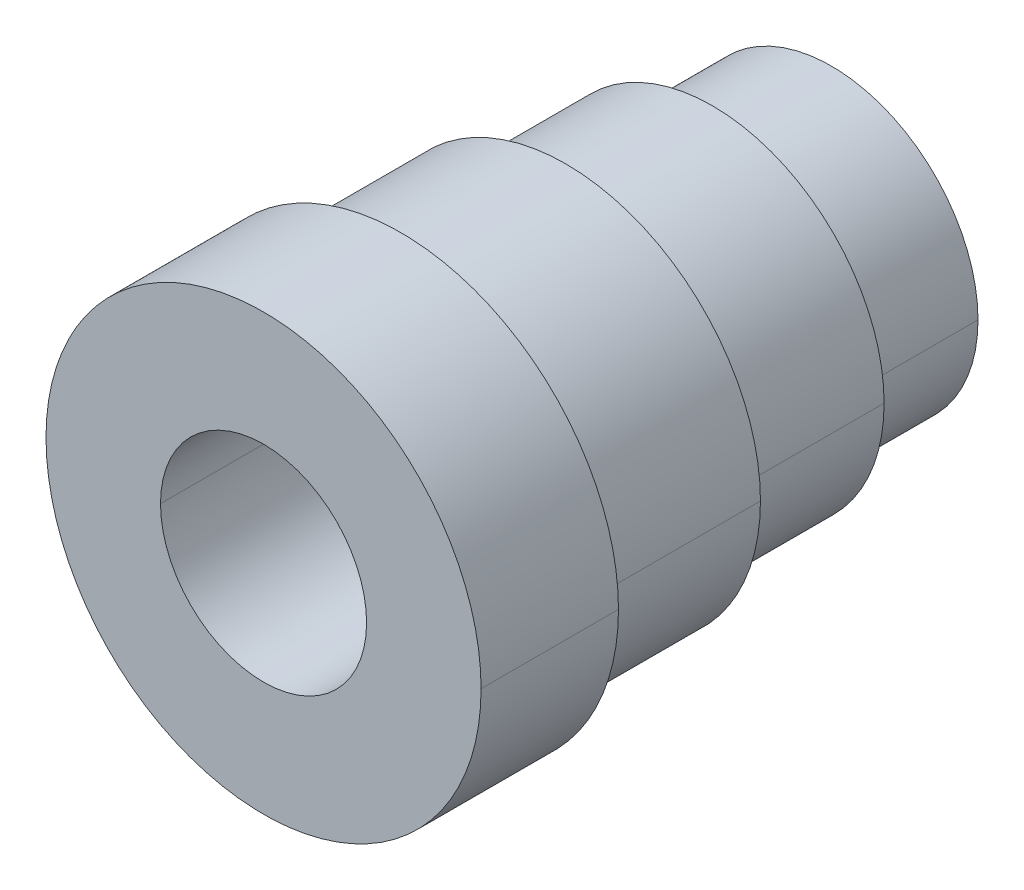
ISO-10303-21;
HEADER;
FILE_DESCRIPTION(('STEP AP214'),'2;1');
FILE_NAME('part.step','',(''),(''),'','','');
FILE_SCHEMA(('AUTOMOTIVE_DESIGN { 1 0 10303 214 1 1 1 1 }'));
ENDSEC;
DATA;
#1=APPLICATION_CONTEXT('core data for automotive mechanical design processes');
#2=APPLICATION_PROTOCOL_DEFINITION('international standard','automotive_design',2000,#1);
#3=PRODUCT_CONTEXT('',#1,'mechanical');
#4=PRODUCT('Part','Part','',(#3));
#5=PRODUCT_RELATED_PRODUCT_CATEGORY('part','',(#4));
#6=PRODUCT_DEFINITION_FORMATION('','',#4);
#7=PRODUCT_DEFINITION_CONTEXT('part definition',#1,'design');
#8=PRODUCT_DEFINITION('design','',#6,#7);
#9=PRODUCT_DEFINITION_SHAPE('','',#8);
#10=(LENGTH_UNIT() NAMED_UNIT(*) SI_UNIT(.MILLI.,.METRE.));
#11=(NAMED_UNIT(*) PLANE_ANGLE_UNIT() SI_UNIT($,.RADIAN.));
#12=(NAMED_UNIT(*) SI_UNIT($,.STERADIAN.) SOLID_ANGLE_UNIT());
#13=UNCERTAINTY_MEASURE_WITH_UNIT(LENGTH_MEASURE(1.E-05),#10,'distance_accuracy_value','');
#14=(GEOMETRIC_REPRESENTATION_CONTEXT(3) GLOBAL_UNCERTAINTY_ASSIGNED_CONTEXT((#13)) GLOBAL_UNIT_ASSIGNED_CONTEXT((#10,
#11,#12)) REPRESENTATION_CONTEXT('',''));
#15=CARTESIAN_POINT('',(0.,0.,0.));
#16=DIRECTION('',(0.,0.,1.));
#17=DIRECTION('',(1.,0.,0.));
#18=AXIS2_PLACEMENT_3D('',#15,#16,#17);
#19=CARTESIAN_POINT('',(12.7,0.,2.6));
#20=DIRECTION('',(0.,0.,1.));
#21=DIRECTION('',(1.,0.,0.));
#22=AXIS2_PLACEMENT_3D('',#19,#20,#21);
#23=CYLINDRICAL_SURFACE('',#22,2.5);
#24=CARTESIAN_POINT('',(12.7,0.,-9.8));
#25=DIRECTION('',(0.,0.,1.));
#26=DIRECTION('',(1.,0.,0.));
#27=AXIS2_PLACEMENT_3D('',#24,#25,#26);
#28=CIRCLE('',#27,2.5);
#29=CARTESIAN_POINT('',(10.2,0.,-9.8));
#30=VERTEX_POINT('',#29);
#31=CARTESIAN_POINT('',(15.2,0.,-9.8));
#32=VERTEX_POINT('',#31);
#33=EDGE_CURVE('E42',#30,#32,#28,.T.);
#34=ORIENTED_EDGE('',*,*,#33,.F.);
#35=DIRECTION('',(0.,0.,1.));
#36=VECTOR('',#35,1.);
#37=CARTESIAN_POINT('',(10.2,0.,2.6));
#38=LINE('',#37,#36);
#39=CARTESIAN_POINT('',(10.2,0.,-7.3));
#40=VERTEX_POINT('',#39);
#41=EDGE_CURVE('E11',#30,#40,#38,.T.);
#42=ORIENTED_EDGE('',*,*,#41,.T.);
#43=CARTESIAN_POINT('',(12.7,0.,-7.3));
#44=DIRECTION('',(0.,0.,1.));
#45=DIRECTION('',(1.,0.,0.));
#46=AXIS2_PLACEMENT_3D('',#43,#44,#45);
#47=CIRCLE('',#46,2.5);
#48=CARTESIAN_POINT('',(15.2,0.,-7.3));
#49=VERTEX_POINT('',#48);
#50=EDGE_CURVE('E28',#40,#49,#47,.T.);
#51=ORIENTED_EDGE('',*,*,#50,.T.);
#52=DIRECTION('',(0.,0.,1.));
#53=VECTOR('',#52,1.);
#54=CARTESIAN_POINT('',(15.2,0.,2.6));
#55=LINE('',#54,#53);
#56=EDGE_CURVE('E212',#32,#49,#55,.T.);
#57=ORIENTED_EDGE('',*,*,#56,.F.);
#58=EDGE_LOOP('',(#34,#42,#51,#57));
#59=FACE_BOUND('',#58,.T.);
#60=ADVANCED_FACE('F17',(#59),#23,.F.);
#61=CARTESIAN_POINT('',(12.7,0.,2.6));
#62=DIRECTION('',(0.,0.,1.));
#63=DIRECTION('',(1.,0.,0.));
#64=AXIS2_PLACEMENT_3D('',#61,#62,#63);
#65=CYLINDRICAL_SURFACE('',#64,3.2);
#66=CARTESIAN_POINT('',(12.7,0.,-9.8));
#67=DIRECTION('',(0.,0.,1.));
#68=DIRECTION('',(1.,0.,0.));
#69=AXIS2_PLACEMENT_3D('',#66,#67,#68);
#70=CIRCLE('',#69,3.2);
#71=CARTESIAN_POINT('',(15.9,0.,-9.8));
#72=VERTEX_POINT('',#71);
#73=CARTESIAN_POINT('',(9.5,0.,-9.8));
#74=VERTEX_POINT('',#73);
#75=EDGE_CURVE('E204',#72,#74,#70,.T.);
#76=ORIENTED_EDGE('',*,*,#75,.T.);
#77=DIRECTION('',(0.,0.,1.));
#78=VECTOR('',#77,1.);
#79=CARTESIAN_POINT('',(9.5,0.,2.6));
#80=LINE('',#79,#78);
#81=CARTESIAN_POINT('',(9.5,0.,-7.2));
#82=VERTEX_POINT('',#81);
#83=EDGE_CURVE('E192',#74,#82,#80,.T.);
#84=ORIENTED_EDGE('',*,*,#83,.T.);
#85=CARTESIAN_POINT('',(12.7,0.,-7.2));
#86=DIRECTION('',(0.,0.,1.));
#87=DIRECTION('',(1.,0.,0.));
#88=AXIS2_PLACEMENT_3D('',#85,#86,#87);
#89=CIRCLE('',#88,3.2);
#90=CARTESIAN_POINT('',(15.9,0.,-7.2));
#91=VERTEX_POINT('',#90);
#92=EDGE_CURVE('E229',#91,#82,#89,.T.);
#93=ORIENTED_EDGE('',*,*,#92,.F.);
#94=DIRECTION('',(0.,0.,1.));
#95=VECTOR('',#94,1.);
#96=CARTESIAN_POINT('',(15.9,0.,2.6));
#97=LINE('',#96,#95);
#98=EDGE_CURVE('E183',#72,#91,#97,.T.);
#99=ORIENTED_EDGE('',*,*,#98,.F.);
#100=EDGE_LOOP('',(#76,#84,#93,#99));
#101=FACE_BOUND('',#100,.T.);
#102=ADVANCED_FACE('F288',(#101),#65,.T.);
#103=CARTESIAN_POINT('',(12.7,0.,2.6));
#104=DIRECTION('',(0.,0.,1.));
#105=DIRECTION('',(1.,0.,0.));
#106=AXIS2_PLACEMENT_3D('',#103,#104,#105);
#107=CYLINDRICAL_SURFACE('',#106,3.75);
#108=CARTESIAN_POINT('',(12.7,0.,-7.2));
#109=DIRECTION('',(0.,0.,1.));
#110=DIRECTION('',(1.,0.,0.));
#111=AXIS2_PLACEMENT_3D('',#108,#109,#110);
#112=CIRCLE('',#111,3.75);
#113=CARTESIAN_POINT('',(16.45,0.,-7.2));
#114=VERTEX_POINT('',#113);
#115=CARTESIAN_POINT('',(8.95,0.,-7.2));
#116=VERTEX_POINT('',#115);
#117=EDGE_CURVE('E188',#114,#116,#112,.T.);
#118=ORIENTED_EDGE('',*,*,#117,.T.);
#119=DIRECTION('',(0.,0.,1.));
#120=VECTOR('',#119,1.);
#121=CARTESIAN_POINT('',(8.95,0.,2.6));
#122=LINE('',#121,#120);
#123=CARTESIAN_POINT('',(8.95,0.,-4.));
#124=VERTEX_POINT('',#123);
#125=EDGE_CURVE('E193',#116,#124,#122,.T.);
#126=ORIENTED_EDGE('',*,*,#125,.T.);
#127=CARTESIAN_POINT('',(12.7,0.,-4.));
#128=DIRECTION('',(0.,0.,1.));
#129=DIRECTION('',(1.,0.,0.));
#130=AXIS2_PLACEMENT_3D('',#127,#128,#129);
#131=CIRCLE('',#130,3.75);
#132=CARTESIAN_POINT('',(16.45,0.,-4.));
#133=VERTEX_POINT('',#132);
#134=EDGE_CURVE('E158',#133,#124,#131,.T.);
#135=ORIENTED_EDGE('',*,*,#134,.F.);
#136=DIRECTION('',(0.,0.,1.));
#137=VECTOR('',#136,1.);
#138=CARTESIAN_POINT('',(16.45,0.,2.6));
#139=LINE('',#138,#137);
#140=EDGE_CURVE('E225',#114,#133,#139,.T.);
#141=ORIENTED_EDGE('',*,*,#140,.F.);
#142=EDGE_LOOP('',(#118,#126,#135,#141));
#143=FACE_BOUND('',#142,.T.);
#144=ADVANCED_FACE('F278',(#143),#107,.T.);
#145=CARTESIAN_POINT('',(12.7,0.,2.6));
#146=DIRECTION('',(0.,0.,1.));
#147=DIRECTION('',(1.,0.,0.));
#148=AXIS2_PLACEMENT_3D('',#145,#146,#147);
#149=CYLINDRICAL_SURFACE('',#148,4.25);
#150=CARTESIAN_POINT('',(12.7,0.,-4.));
#151=DIRECTION('',(0.,0.,1.));
#152=DIRECTION('',(1.,0.,0.));
#153=AXIS2_PLACEMENT_3D('',#150,#151,#152);
#154=CIRCLE('',#153,4.25);
#155=CARTESIAN_POINT('',(16.95,0.,-4.));
#156=VERTEX_POINT('',#155);
#157=CARTESIAN_POINT('',(8.45,0.,-4.));
#158=VERTEX_POINT('',#157);
#159=EDGE_CURVE('E194',#156,#158,#154,.T.);
#160=ORIENTED_EDGE('',*,*,#159,.T.);
#161=DIRECTION('',(0.,0.,1.));
#162=VECTOR('',#161,1.);
#163=CARTESIAN_POINT('',(8.45,0.,2.6));
#164=LINE('',#163,#162);
#165=CARTESIAN_POINT('',(8.45,0.,-0.4));
#166=VERTEX_POINT('',#165);
#167=EDGE_CURVE('E163',#158,#166,#164,.T.);
#168=ORIENTED_EDGE('',*,*,#167,.T.);
#169=CARTESIAN_POINT('',(12.7,0.,-0.4));
#170=DIRECTION('',(0.,0.,1.));
#171=DIRECTION('',(1.,0.,0.));
#172=AXIS2_PLACEMENT_3D('',#169,#170,#171);
#173=CIRCLE('',#172,4.25);
#174=CARTESIAN_POINT('',(16.95,0.,-0.4));
#175=VERTEX_POINT('',#174);
#176=EDGE_CURVE('E161',#175,#166,#173,.T.);
#177=ORIENTED_EDGE('',*,*,#176,.F.);
#178=DIRECTION('',(0.,0.,1.));
#179=VECTOR('',#178,1.);
#180=CARTESIAN_POINT('',(16.95,0.,2.6));
#181=LINE('',#180,#179);
#182=EDGE_CURVE('E147',#156,#175,#181,.T.);
#183=ORIENTED_EDGE('',*,*,#182,.F.);
#184=EDGE_LOOP('',(#160,#168,#177,#183));
#185=FACE_BOUND('',#184,.T.);
#186=ADVANCED_FACE('F162',(#185),#149,.T.);
#187=CARTESIAN_POINT('',(12.7,0.,2.6));
#188=DIRECTION('',(0.,0.,1.));
#189=DIRECTION('',(1.,0.,0.));
#190=AXIS2_PLACEMENT_3D('',#187,#188,#189);
#191=CYLINDRICAL_SURFACE('',#190,4.75);
#192=CARTESIAN_POINT('',(12.7,0.,-0.4));
#193=DIRECTION('',(0.,0.,1.));
#194=DIRECTION('',(1.,0.,0.));
#195=AXIS2_PLACEMENT_3D('',#192,#193,#194);
#196=CIRCLE('',#195,4.75);
#197=CARTESIAN_POINT('',(17.45,0.,-0.4));
#198=VERTEX_POINT('',#197);
#199=CARTESIAN_POINT('',(7.95,0.,-0.4));
#200=VERTEX_POINT('',#199);
#201=EDGE_CURVE('E250',#198,#200,#196,.T.);
#202=ORIENTED_EDGE('',*,*,#201,.T.);
#203=DIRECTION('',(0.,0.,1.));
#204=VECTOR('',#203,1.);
#205=CARTESIAN_POINT('',(7.95,0.,2.6));
#206=LINE('',#205,#204);
#207=CARTESIAN_POINT('',(7.95,0.,2.6));
#208=VERTEX_POINT('',#207);
#209=EDGE_CURVE('E254',#200,#208,#206,.T.);
#210=ORIENTED_EDGE('',*,*,#209,.T.);
#211=CARTESIAN_POINT('',(12.7,0.,2.6));
#212=DIRECTION('',(0.,0.,1.));
#213=DIRECTION('',(1.,0.,0.));
#214=AXIS2_PLACEMENT_3D('',#211,#212,#213);
#215=CIRCLE('',#214,4.75);
#216=CARTESIAN_POINT('',(17.45,0.,2.6));
#217=VERTEX_POINT('',#216);
#218=EDGE_CURVE('E115',#217,#208,#215,.T.);
#219=ORIENTED_EDGE('',*,*,#218,.F.);
#220=DIRECTION('',(0.,0.,1.));
#221=VECTOR('',#220,1.);
#222=CARTESIAN_POINT('',(17.45,0.,2.6));
#223=LINE('',#222,#221);
#224=EDGE_CURVE('E106',#198,#217,#223,.T.);
#225=ORIENTED_EDGE('',*,*,#224,.F.);
#226=EDGE_LOOP('',(#202,#210,#219,#225));
#227=FACE_BOUND('',#226,.T.);
#228=ADVANCED_FACE('F328',(#227),#191,.T.);
#229=CARTESIAN_POINT('',(12.7,0.,2.6));
#230=DIRECTION('',(0.,0.,1.));
#231=DIRECTION('',(1.,0.,0.));
#232=AXIS2_PLACEMENT_3D('',#229,#230,#231);
#233=CYLINDRICAL_SURFACE('',#232,2.25);
#234=CARTESIAN_POINT('',(12.7,0.,-7.3));
#235=DIRECTION('',(0.,0.,1.));
#236=DIRECTION('',(1.,0.,0.));
#237=AXIS2_PLACEMENT_3D('',#234,#235,#236);
#238=CIRCLE('',#237,2.25);
#239=CARTESIAN_POINT('',(10.45,0.,-7.3));
#240=VERTEX_POINT('',#239);
#241=CARTESIAN_POINT('',(14.95,0.,-7.3));
#242=VERTEX_POINT('',#241);
#243=EDGE_CURVE('E220',#240,#242,#238,.T.);
#244=ORIENTED_EDGE('',*,*,#243,.F.);
#245=DIRECTION('',(0.,0.,1.));
#246=VECTOR('',#245,1.);
#247=CARTESIAN_POINT('',(10.45,0.,2.6));
#248=LINE('',#247,#246);
#249=CARTESIAN_POINT('',(10.45,0.,2.6));
#250=VERTEX_POINT('',#249);
#251=EDGE_CURVE('E199',#240,#250,#248,.T.);
#252=ORIENTED_EDGE('',*,*,#251,.T.);
#253=CARTESIAN_POINT('',(12.7,0.,2.6));
#254=DIRECTION('',(0.,0.,-1.));
#255=DIRECTION('',(1.,0.,0.));
#256=AXIS2_PLACEMENT_3D('',#253,#254,#255);
#257=CIRCLE('',#256,2.25);
#258=CARTESIAN_POINT('',(14.95,0.,2.6));
#259=VERTEX_POINT('',#258);
#260=EDGE_CURVE('E205',#259,#250,#257,.T.);
#261=ORIENTED_EDGE('',*,*,#260,.F.);
#262=DIRECTION('',(0.,0.,1.));
#263=VECTOR('',#262,1.);
#264=CARTESIAN_POINT('',(14.95,0.,2.6));
#265=LINE('',#264,#263);
#266=EDGE_CURVE('E21',#242,#259,#265,.T.);
#267=ORIENTED_EDGE('',*,*,#266,.F.);
#268=EDGE_LOOP('',(#244,#252,#261,#267));
#269=FACE_BOUND('',#268,.T.);
#270=ADVANCED_FACE('F334',(#269),#233,.F.);
#271=CARTESIAN_POINT('',(9.55,0.,2.6));
#272=DIRECTION('',(0.,0.,1.));
#273=DIRECTION('',(1.,0.,0.));
#274=AXIS2_PLACEMENT_3D('',#271,#272,#273);
#275=PLANE('',#274);
#276=ORIENTED_EDGE('',*,*,#218,.T.);
#277=CARTESIAN_POINT('',(12.7,0.,2.6));
#278=DIRECTION('',(0.,0.,1.));
#279=DIRECTION('',(1.,0.,0.));
#280=AXIS2_PLACEMENT_3D('',#277,#278,#279);
#281=CIRCLE('',#280,4.75);
#282=EDGE_CURVE('E200',#208,#217,#281,.T.);
#283=ORIENTED_EDGE('',*,*,#282,.T.);
#284=EDGE_LOOP('',(#276,#283));
#285=FACE_BOUND('',#284,.T.);
#286=ORIENTED_EDGE('',*,*,#260,.T.);
#287=CARTESIAN_POINT('',(12.7,0.,2.6));
#288=DIRECTION('',(0.,0.,-1.));
#289=DIRECTION('',(1.,0.,0.));
#290=AXIS2_PLACEMENT_3D('',#287,#288,#289);
#291=CIRCLE('',#290,2.25);
#292=EDGE_CURVE('E208',#250,#259,#291,.T.);
#293=ORIENTED_EDGE('',*,*,#292,.T.);
#294=EDGE_LOOP('',(#286,#293));
#295=FACE_BOUND('',#294,.T.);
#296=ADVANCED_FACE('F19',(#285,#295),#275,.T.);
#297=CARTESIAN_POINT('',(12.7,0.,2.6));
#298=DIRECTION('',(0.,0.,1.));
#299=DIRECTION('',(1.,0.,0.));
#300=AXIS2_PLACEMENT_3D('',#297,#298,#299);
#301=CYLINDRICAL_SURFACE('',#300,2.25);
#302=ORIENTED_EDGE('',*,*,#251,.F.);
#303=CARTESIAN_POINT('',(12.7,0.,-7.3));
#304=DIRECTION('',(0.,0.,1.));
#305=DIRECTION('',(1.,0.,0.));
#306=AXIS2_PLACEMENT_3D('',#303,#304,#305);
#307=CIRCLE('',#306,2.25);
#308=EDGE_CURVE('E216',#242,#240,#307,.T.);
#309=ORIENTED_EDGE('',*,*,#308,.F.);
#310=ORIENTED_EDGE('',*,*,#266,.T.);
#311=ORIENTED_EDGE('',*,*,#292,.F.);
#312=EDGE_LOOP('',(#302,#309,#310,#311));
#313=FACE_BOUND('',#312,.T.);
#314=ADVANCED_FACE('F315',(#313),#301,.F.);
#315=CARTESIAN_POINT('',(12.7,0.,2.6));
#316=DIRECTION('',(0.,0.,1.));
#317=DIRECTION('',(1.,0.,0.));
#318=AXIS2_PLACEMENT_3D('',#315,#316,#317);
#319=CYLINDRICAL_SURFACE('',#318,4.75);
#320=ORIENTED_EDGE('',*,*,#209,.F.);
#321=CARTESIAN_POINT('',(12.7,0.,-0.4));
#322=DIRECTION('',(0.,0.,1.));
#323=DIRECTION('',(1.,0.,0.));
#324=AXIS2_PLACEMENT_3D('',#321,#322,#323);
#325=CIRCLE('',#324,4.75);
#326=EDGE_CURVE('E242',#200,#198,#325,.T.);
#327=ORIENTED_EDGE('',*,*,#326,.T.);
#328=ORIENTED_EDGE('',*,*,#224,.T.);
#329=ORIENTED_EDGE('',*,*,#282,.F.);
#330=EDGE_LOOP('',(#320,#327,#328,#329));
#331=FACE_BOUND('',#330,.T.);
#332=ADVANCED_FACE('F331',(#331),#319,.T.);
#333=CARTESIAN_POINT('',(7.95,0.,-0.4));
#334=DIRECTION('',(0.,0.,-1.));
#335=DIRECTION('',(0.,-1.,0.));
#336=AXIS2_PLACEMENT_3D('',#333,#334,#335);
#337=PLANE('',#336);
#338=ORIENTED_EDGE('',*,*,#201,.F.);
#339=ORIENTED_EDGE('',*,*,#326,.F.);
#340=EDGE_LOOP('',(#338,#339));
#341=FACE_BOUND('',#340,.T.);
#342=ORIENTED_EDGE('',*,*,#176,.T.);
#343=CARTESIAN_POINT('',(12.7,0.,-0.4));
#344=DIRECTION('',(0.,0.,1.));
#345=DIRECTION('',(1.,0.,0.));
#346=AXIS2_PLACEMENT_3D('',#343,#344,#345);
#347=CIRCLE('',#346,4.25);
#348=EDGE_CURVE('E151',#166,#175,#347,.T.);
#349=ORIENTED_EDGE('',*,*,#348,.T.);
#350=EDGE_LOOP('',(#342,#349));
#351=FACE_BOUND('',#350,.T.);
#352=ADVANCED_FACE('F166',(#341,#351),#337,.T.);
#353=CARTESIAN_POINT('',(12.7,0.,2.6));
#354=DIRECTION('',(0.,0.,1.));
#355=DIRECTION('',(1.,0.,0.));
#356=AXIS2_PLACEMENT_3D('',#353,#354,#355);
#357=CYLINDRICAL_SURFACE('',#356,4.25);
#358=ORIENTED_EDGE('',*,*,#167,.F.);
#359=CARTESIAN_POINT('',(12.7,0.,-4.));
#360=DIRECTION('',(0.,0.,1.));
#361=DIRECTION('',(1.,0.,0.));
#362=AXIS2_PLACEMENT_3D('',#359,#360,#361);
#363=CIRCLE('',#362,4.25);
#364=EDGE_CURVE('E153',#158,#156,#363,.T.);
#365=ORIENTED_EDGE('',*,*,#364,.T.);
#366=ORIENTED_EDGE('',*,*,#182,.T.);
#367=ORIENTED_EDGE('',*,*,#348,.F.);
#368=EDGE_LOOP('',(#358,#365,#366,#367));
#369=FACE_BOUND('',#368,.T.);
#370=ADVANCED_FACE('F149',(#369),#357,.T.);
#371=CARTESIAN_POINT('',(8.45,0.,-4.));
#372=DIRECTION('',(0.,0.,-1.));
#373=DIRECTION('',(0.,-1.,0.));
#374=AXIS2_PLACEMENT_3D('',#371,#372,#373);
#375=PLANE('',#374);
#376=ORIENTED_EDGE('',*,*,#159,.F.);
#377=ORIENTED_EDGE('',*,*,#364,.F.);
#378=EDGE_LOOP('',(#376,#377));
#379=FACE_BOUND('',#378,.T.);
#380=ORIENTED_EDGE('',*,*,#134,.T.);
#381=CARTESIAN_POINT('',(12.7,0.,-4.));
#382=DIRECTION('',(0.,0.,1.));
#383=DIRECTION('',(1.,0.,0.));
#384=AXIS2_PLACEMENT_3D('',#381,#382,#383);
#385=CIRCLE('',#384,3.75);
#386=EDGE_CURVE('E176',#124,#133,#385,.T.);
#387=ORIENTED_EDGE('',*,*,#386,.T.);
#388=EDGE_LOOP('',(#380,#387));
#389=FACE_BOUND('',#388,.T.);
#390=ADVANCED_FACE('F272',(#379,#389),#375,.T.);
#391=CARTESIAN_POINT('',(12.7,0.,2.6));
#392=DIRECTION('',(0.,0.,1.));
#393=DIRECTION('',(1.,0.,0.));
#394=AXIS2_PLACEMENT_3D('',#391,#392,#393);
#395=CYLINDRICAL_SURFACE('',#394,3.75);
#396=ORIENTED_EDGE('',*,*,#125,.F.);
#397=CARTESIAN_POINT('',(12.7,0.,-7.2));
#398=DIRECTION('',(0.,0.,1.));
#399=DIRECTION('',(1.,0.,0.));
#400=AXIS2_PLACEMENT_3D('',#397,#398,#399);
#401=CIRCLE('',#400,3.75);
#402=EDGE_CURVE('E221',#116,#114,#401,.T.);
#403=ORIENTED_EDGE('',*,*,#402,.T.);
#404=ORIENTED_EDGE('',*,*,#140,.T.);
#405=ORIENTED_EDGE('',*,*,#386,.F.);
#406=EDGE_LOOP('',(#396,#403,#404,#405));
#407=FACE_BOUND('',#406,.T.);
#408=ADVANCED_FACE('F274',(#407),#395,.T.);
#409=CARTESIAN_POINT('',(8.95,0.,-7.2));
#410=DIRECTION('',(0.,0.,-1.));
#411=DIRECTION('',(0.,-1.,0.));
#412=AXIS2_PLACEMENT_3D('',#409,#410,#411);
#413=PLANE('',#412);
#414=ORIENTED_EDGE('',*,*,#117,.F.);
#415=ORIENTED_EDGE('',*,*,#402,.F.);
#416=EDGE_LOOP('',(#414,#415));
#417=FACE_BOUND('',#416,.T.);
#418=ORIENTED_EDGE('',*,*,#92,.T.);
#419=CARTESIAN_POINT('',(12.7,0.,-7.2));
#420=DIRECTION('',(0.,0.,1.));
#421=DIRECTION('',(1.,0.,0.));
#422=AXIS2_PLACEMENT_3D('',#419,#420,#421);
#423=CIRCLE('',#422,3.2);
#424=EDGE_CURVE('E182',#82,#91,#423,.T.);
#425=ORIENTED_EDGE('',*,*,#424,.T.);
#426=EDGE_LOOP('',(#418,#425));
#427=FACE_BOUND('',#426,.T.);
#428=ADVANCED_FACE('F280',(#417,#427),#413,.T.);
#429=CARTESIAN_POINT('',(12.7,0.,2.6));
#430=DIRECTION('',(0.,0.,1.));
#431=DIRECTION('',(1.,0.,0.));
#432=AXIS2_PLACEMENT_3D('',#429,#430,#431);
#433=CYLINDRICAL_SURFACE('',#432,3.2);
#434=ORIENTED_EDGE('',*,*,#83,.F.);
#435=CARTESIAN_POINT('',(12.7,0.,-9.8));
#436=DIRECTION('',(0.,0.,1.));
#437=DIRECTION('',(1.,0.,0.));
#438=AXIS2_PLACEMENT_3D('',#435,#436,#437);
#439=CIRCLE('',#438,3.2);
#440=EDGE_CURVE('E178',#74,#72,#439,.T.);
#441=ORIENTED_EDGE('',*,*,#440,.T.);
#442=ORIENTED_EDGE('',*,*,#98,.T.);
#443=ORIENTED_EDGE('',*,*,#424,.F.);
#444=EDGE_LOOP('',(#434,#441,#442,#443));
#445=FACE_BOUND('',#444,.T.);
#446=ADVANCED_FACE('F283',(#445),#433,.T.);
#447=CARTESIAN_POINT('',(9.5,0.,-9.8));
#448=DIRECTION('',(0.,0.,-1.));
#449=DIRECTION('',(0.,-1.,0.));
#450=AXIS2_PLACEMENT_3D('',#447,#448,#449);
#451=PLANE('',#450);
#452=ORIENTED_EDGE('',*,*,#75,.F.);
#453=ORIENTED_EDGE('',*,*,#440,.F.);
#454=EDGE_LOOP('',(#452,#453));
#455=FACE_BOUND('',#454,.T.);
#456=CARTESIAN_POINT('',(12.7,0.,-9.8));
#457=DIRECTION('',(0.,0.,1.));
#458=DIRECTION('',(1.,0.,0.));
#459=AXIS2_PLACEMENT_3D('',#456,#457,#458);
#460=CIRCLE('',#459,2.5);
#461=EDGE_CURVE('E184',#32,#30,#460,.T.);
#462=ORIENTED_EDGE('',*,*,#461,.T.);
#463=ORIENTED_EDGE('',*,*,#33,.T.);
#464=EDGE_LOOP('',(#462,#463));
#465=FACE_BOUND('',#464,.T.);
#466=ADVANCED_FACE('F302',(#455,#465),#451,.T.);
#467=CARTESIAN_POINT('',(12.7,0.,2.6));
#468=DIRECTION('',(0.,0.,1.));
#469=DIRECTION('',(1.,0.,0.));
#470=AXIS2_PLACEMENT_3D('',#467,#468,#469);
#471=CYLINDRICAL_SURFACE('',#470,2.5);
#472=ORIENTED_EDGE('',*,*,#41,.F.);
#473=ORIENTED_EDGE('',*,*,#461,.F.);
#474=ORIENTED_EDGE('',*,*,#56,.T.);
#475=CARTESIAN_POINT('',(12.7,0.,-7.3));
#476=DIRECTION('',(0.,0.,1.));
#477=DIRECTION('',(1.,0.,0.));
#478=AXIS2_PLACEMENT_3D('',#475,#476,#477);
#479=CIRCLE('',#478,2.5);
#480=EDGE_CURVE('E215',#49,#40,#479,.T.);
#481=ORIENTED_EDGE('',*,*,#480,.T.);
#482=EDGE_LOOP('',(#472,#473,#474,#481));
#483=FACE_BOUND('',#482,.T.);
#484=ADVANCED_FACE('F304',(#483),#471,.F.);
#485=CARTESIAN_POINT('',(12.7,0.,-7.3));
#486=DIRECTION('',(0.,0.,1.));
#487=DIRECTION('',(1.,0.,0.));
#488=AXIS2_PLACEMENT_3D('',#485,#486,#487);
#489=PLANE('',#488);
#490=ORIENTED_EDGE('',*,*,#480,.F.);
#491=ORIENTED_EDGE('',*,*,#50,.F.);
#492=EDGE_LOOP('',(#490,#491));
#493=FACE_BOUND('',#492,.T.);
#494=ORIENTED_EDGE('',*,*,#308,.T.);
#495=ORIENTED_EDGE('',*,*,#243,.T.);
#496=EDGE_LOOP('',(#494,#495));
#497=FACE_BOUND('',#496,.T.);
#498=ADVANCED_FACE('F307',(#493,#497),#489,.F.);
#499=CLOSED_SHELL('',(#60,#102,#144,#186,#228,#270,#296,#314,#332,#352,#370,#390,#408,#428,#446,
#466,#484,#498));
#500=MANIFOLD_SOLID_BREP('B1',#499);
#501=ADVANCED_BREP_SHAPE_REPRESENTATION('',(#18,#500),#14);
#502=SHAPE_DEFINITION_REPRESENTATION(#9,#501);
ENDSEC;
END-ISO-10303-21;
